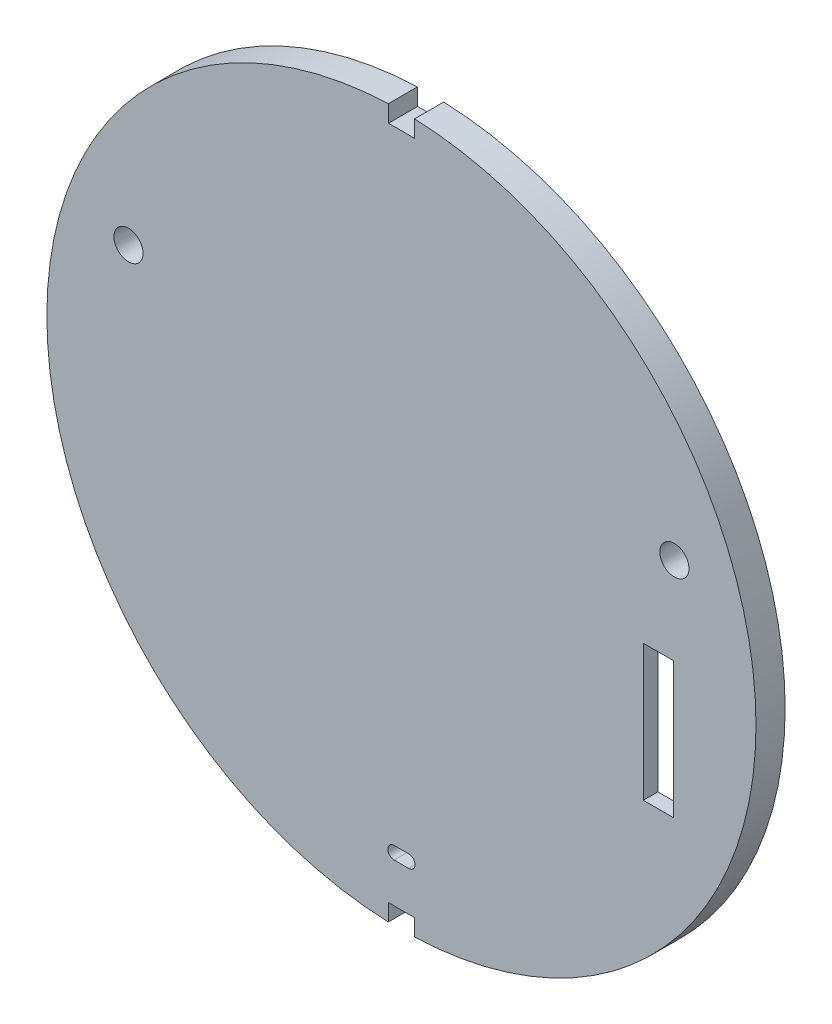
ISO-10303-21;
HEADER;
FILE_DESCRIPTION(('STEP AP214'),'2;1');
FILE_NAME('part.step','',(''),(''),'','','');
FILE_SCHEMA(('AUTOMOTIVE_DESIGN { 1 0 10303 214 1 1 1 1 }'));
ENDSEC;
DATA;
#1=APPLICATION_CONTEXT('core data for automotive mechanical design processes');
#2=APPLICATION_PROTOCOL_DEFINITION('international standard','automotive_design',2000,#1);
#3=PRODUCT_CONTEXT('',#1,'mechanical');
#4=PRODUCT('Part','Part','',(#3));
#5=PRODUCT_RELATED_PRODUCT_CATEGORY('part','',(#4));
#6=PRODUCT_DEFINITION_FORMATION('','',#4);
#7=PRODUCT_DEFINITION_CONTEXT('part definition',#1,'design');
#8=PRODUCT_DEFINITION('design','',#6,#7);
#9=PRODUCT_DEFINITION_SHAPE('','',#8);
#10=(LENGTH_UNIT() NAMED_UNIT(*) SI_UNIT(.MILLI.,.METRE.));
#11=(NAMED_UNIT(*) PLANE_ANGLE_UNIT() SI_UNIT($,.RADIAN.));
#12=(NAMED_UNIT(*) SI_UNIT($,.STERADIAN.) SOLID_ANGLE_UNIT());
#13=UNCERTAINTY_MEASURE_WITH_UNIT(LENGTH_MEASURE(1.E-05),#10,'distance_accuracy_value','');
#14=(GEOMETRIC_REPRESENTATION_CONTEXT(3) GLOBAL_UNCERTAINTY_ASSIGNED_CONTEXT((#13)) GLOBAL_UNIT_ASSIGNED_CONTEXT((#10,
#11,#12)) REPRESENTATION_CONTEXT('',''));
#15=CARTESIAN_POINT('',(0.,0.,0.));
#16=DIRECTION('',(0.,0.,1.));
#17=DIRECTION('',(1.,0.,0.));
#18=AXIS2_PLACEMENT_3D('',#15,#16,#17);
#19=CARTESIAN_POINT('',(-22.4999999999999,-22.5,-3.));
#20=DIRECTION('',(0.707106781186546,0.707106781186549,0.));
#21=DIRECTION('',(-0.707106781186549,0.707106781186546,0.));
#22=AXIS2_PLACEMENT_3D('',#19,#20,#21);
#23=PLANE('',#22);
#24=DIRECTION('',(0.,0.,1.));
#25=VECTOR('',#24,1.);
#26=CARTESIAN_POINT('',(-28.,-17.,-3.));
#27=LINE('',#26,#25);
#28=CARTESIAN_POINT('',(-28.,-17.,-3.));
#29=VERTEX_POINT('',#28);
#30=CARTESIAN_POINT('',(-28.,-17.,-1.5));
#31=VERTEX_POINT('',#30);
#32=EDGE_CURVE('E258',#29,#31,#27,.T.);
#33=ORIENTED_EDGE('',*,*,#32,.T.);
#34=DIRECTION('',(-0.707106781186549,0.707106781186546,0.));
#35=VECTOR('',#34,1.);
#36=CARTESIAN_POINT('',(-22.4999999999999,-22.5,-1.5));
#37=LINE('',#36,#35);
#38=CARTESIAN_POINT('',(-21.5,-23.5,-1.5));
#39=VERTEX_POINT('',#38);
#40=EDGE_CURVE('E462',#39,#31,#37,.T.);
#41=ORIENTED_EDGE('',*,*,#40,.F.);
#42=DIRECTION('',(0.,0.,1.));
#43=VECTOR('',#42,1.);
#44=CARTESIAN_POINT('',(-21.5,-23.5,-3.));
#45=LINE('',#44,#43);
#46=CARTESIAN_POINT('',(-21.5,-23.5,-3.));
#47=VERTEX_POINT('',#46);
#48=EDGE_CURVE('E243',#47,#39,#45,.T.);
#49=ORIENTED_EDGE('',*,*,#48,.F.);
#50=DIRECTION('',(-0.707106781186549,0.707106781186546,0.));
#51=VECTOR('',#50,1.);
#52=CARTESIAN_POINT('',(-22.4999999999999,-22.5,-3.));
#53=LINE('',#52,#51);
#54=EDGE_CURVE('E284',#47,#29,#53,.T.);
#55=ORIENTED_EDGE('',*,*,#54,.T.);
#56=EDGE_LOOP('',(#33,#41,#49,#55));
#57=FACE_BOUND('',#56,.T.);
#58=ADVANCED_FACE('F37',(#57),#23,.T.);
#59=CARTESIAN_POINT('',(0.,-23.5,-3.));
#60=DIRECTION('',(0.,1.,0.));
#61=DIRECTION('',(-1.,0.,0.));
#62=AXIS2_PLACEMENT_3D('',#59,#60,#61);
#63=PLANE('',#62);
#64=ORIENTED_EDGE('',*,*,#48,.T.);
#65=DIRECTION('',(-1.,0.,0.));
#66=VECTOR('',#65,1.);
#67=CARTESIAN_POINT('',(0.,-23.5,-1.5));
#68=LINE('',#67,#66);
#69=CARTESIAN_POINT('',(21.5,-23.5,-1.5));
#70=VERTEX_POINT('',#69);
#71=EDGE_CURVE('E459',#70,#39,#68,.T.);
#72=ORIENTED_EDGE('',*,*,#71,.F.);
#73=DIRECTION('',(0.,0.,1.));
#74=VECTOR('',#73,1.);
#75=CARTESIAN_POINT('',(21.5,-23.5,-3.));
#76=LINE('',#75,#74);
#77=CARTESIAN_POINT('',(21.5,-23.5,-3.));
#78=VERTEX_POINT('',#77);
#79=EDGE_CURVE('E246',#78,#70,#76,.T.);
#80=ORIENTED_EDGE('',*,*,#79,.F.);
#81=DIRECTION('',(-1.,0.,0.));
#82=VECTOR('',#81,1.);
#83=CARTESIAN_POINT('',(0.,-23.5,-3.));
#84=LINE('',#83,#82);
#85=EDGE_CURVE('E304',#78,#47,#84,.T.);
#86=ORIENTED_EDGE('',*,*,#85,.T.);
#87=EDGE_LOOP('',(#64,#72,#80,#86));
#88=FACE_BOUND('',#87,.T.);
#89=ADVANCED_FACE('F345',(#88),#63,.T.);
#90=CARTESIAN_POINT('',(22.5,-22.5,-3.));
#91=DIRECTION('',(-0.707106781186546,0.707106781186548,0.));
#92=DIRECTION('',(-0.707106781186549,-0.707106781186546,0.));
#93=AXIS2_PLACEMENT_3D('',#90,#91,#92);
#94=PLANE('',#93);
#95=ORIENTED_EDGE('',*,*,#79,.T.);
#96=DIRECTION('',(-0.707106781186549,-0.707106781186546,0.));
#97=VECTOR('',#96,1.);
#98=CARTESIAN_POINT('',(22.5,-22.5,-1.5));
#99=LINE('',#98,#97);
#100=CARTESIAN_POINT('',(28.,-17.,-1.5));
#101=VERTEX_POINT('',#100);
#102=EDGE_CURVE('E418',#101,#70,#99,.T.);
#103=ORIENTED_EDGE('',*,*,#102,.F.);
#104=DIRECTION('',(0.,0.,1.));
#105=VECTOR('',#104,1.);
#106=CARTESIAN_POINT('',(28.,-17.,-3.));
#107=LINE('',#106,#105);
#108=CARTESIAN_POINT('',(28.,-17.,-3.));
#109=VERTEX_POINT('',#108);
#110=EDGE_CURVE('E249',#109,#101,#107,.T.);
#111=ORIENTED_EDGE('',*,*,#110,.F.);
#112=DIRECTION('',(-0.707106781186549,-0.707106781186546,0.));
#113=VECTOR('',#112,1.);
#114=CARTESIAN_POINT('',(22.5,-22.5,-3.));
#115=LINE('',#114,#113);
#116=EDGE_CURVE('E301',#109,#78,#115,.T.);
#117=ORIENTED_EDGE('',*,*,#116,.T.);
#118=EDGE_LOOP('',(#95,#103,#111,#117));
#119=FACE_BOUND('',#118,.T.);
#120=ADVANCED_FACE('F351',(#119),#94,.T.);
#121=CARTESIAN_POINT('',(28.,0.,-3.));
#122=DIRECTION('',(-1.,0.,0.));
#123=DIRECTION('',(0.,-1.,0.));
#124=AXIS2_PLACEMENT_3D('',#121,#122,#123);
#125=PLANE('',#124);
#126=DIRECTION('',(0.,-1.,0.));
#127=VECTOR('',#126,1.);
#128=CARTESIAN_POINT('',(28.,0.,-1.5));
#129=LINE('',#128,#127);
#130=CARTESIAN_POINT('',(28.,-12.5,-1.5));
#131=VERTEX_POINT('',#130);
#132=EDGE_CURVE('E421',#131,#101,#129,.T.);
#133=ORIENTED_EDGE('',*,*,#132,.F.);
#134=DIRECTION('',(0.,0.,1.));
#135=VECTOR('',#134,1.);
#136=CARTESIAN_POINT('',(28.,-12.5,-1.5));
#137=LINE('',#136,#135);
#138=CARTESIAN_POINT('',(28.,-12.5,0.));
#139=VERTEX_POINT('',#138);
#140=EDGE_CURVE('E194',#131,#139,#137,.T.);
#141=ORIENTED_EDGE('',*,*,#140,.T.);
#142=DIRECTION('',(0.,-1.,0.));
#143=VECTOR('',#142,1.);
#144=CARTESIAN_POINT('',(28.,0.,0.));
#145=LINE('',#144,#143);
#146=CARTESIAN_POINT('',(28.,1.5,0.));
#147=VERTEX_POINT('',#146);
#148=EDGE_CURVE('E201',#147,#139,#145,.T.);
#149=ORIENTED_EDGE('',*,*,#148,.F.);
#150=DIRECTION('',(0.,0.,1.));
#151=VECTOR('',#150,1.);
#152=CARTESIAN_POINT('',(28.,1.5,-1.5));
#153=LINE('',#152,#151);
#154=CARTESIAN_POINT('',(28.,1.5,-1.5));
#155=VERTEX_POINT('',#154);
#156=EDGE_CURVE('E477',#155,#147,#153,.T.);
#157=ORIENTED_EDGE('',*,*,#156,.F.);
#158=CARTESIAN_POINT('',(28.,4.5,-1.5));
#159=VERTEX_POINT('',#158);
#160=EDGE_CURVE('E407',#159,#155,#129,.T.);
#161=ORIENTED_EDGE('',*,*,#160,.F.);
#162=DIRECTION('',(0.,0.,1.));
#163=VECTOR('',#162,1.);
#164=CARTESIAN_POINT('',(28.,4.5,-3.));
#165=LINE('',#164,#163);
#166=CARTESIAN_POINT('',(28.,4.5,-3.));
#167=VERTEX_POINT('',#166);
#168=EDGE_CURVE('E252',#167,#159,#165,.T.);
#169=ORIENTED_EDGE('',*,*,#168,.F.);
#170=DIRECTION('',(0.,-1.,0.));
#171=VECTOR('',#170,1.);
#172=CARTESIAN_POINT('',(28.,0.,-3.));
#173=LINE('',#172,#171);
#174=EDGE_CURVE('E298',#167,#109,#173,.T.);
#175=ORIENTED_EDGE('',*,*,#174,.T.);
#176=ORIENTED_EDGE('',*,*,#110,.T.);
#177=EDGE_LOOP('',(#133,#141,#149,#157,#161,#169,#175,#176));
#178=FACE_BOUND('',#177,.T.);
#179=ADVANCED_FACE('F383',(#178),#125,.T.);
#180=CARTESIAN_POINT('',(0.,4.5,-3.));
#181=DIRECTION('',(0.,-1.,0.));
#182=DIRECTION('',(1.,0.,0.));
#183=AXIS2_PLACEMENT_3D('',#180,#181,#182);
#184=PLANE('',#183);
#185=ORIENTED_EDGE('',*,*,#168,.T.);
#186=DIRECTION('',(1.,0.,0.));
#187=VECTOR('',#186,1.);
#188=CARTESIAN_POINT('',(0.,4.5,-1.5));
#189=LINE('',#188,#187);
#190=CARTESIAN_POINT('',(-28.,4.5,-1.5));
#191=VERTEX_POINT('',#190);
#192=EDGE_CURVE('E398',#191,#159,#189,.T.);
#193=ORIENTED_EDGE('',*,*,#192,.F.);
#194=DIRECTION('',(0.,0.,1.));
#195=VECTOR('',#194,1.);
#196=CARTESIAN_POINT('',(-28.,4.5,-3.));
#197=LINE('',#196,#195);
#198=CARTESIAN_POINT('',(-28.,4.5,-3.));
#199=VERTEX_POINT('',#198);
#200=EDGE_CURVE('E255',#199,#191,#197,.T.);
#201=ORIENTED_EDGE('',*,*,#200,.F.);
#202=DIRECTION('',(1.,0.,0.));
#203=VECTOR('',#202,1.);
#204=CARTESIAN_POINT('',(0.,4.5,-3.));
#205=LINE('',#204,#203);
#206=EDGE_CURVE('E295',#199,#167,#205,.T.);
#207=ORIENTED_EDGE('',*,*,#206,.T.);
#208=EDGE_LOOP('',(#185,#193,#201,#207));
#209=FACE_BOUND('',#208,.T.);
#210=ADVANCED_FACE('F386',(#209),#184,.T.);
#211=CARTESIAN_POINT('',(-28.,0.,-3.));
#212=DIRECTION('',(1.,0.,0.));
#213=DIRECTION('',(0.,0.,-1.));
#214=AXIS2_PLACEMENT_3D('',#211,#212,#213);
#215=PLANE('',#214);
#216=ORIENTED_EDGE('',*,*,#200,.T.);
#217=DIRECTION('',(0.,1.,0.));
#218=VECTOR('',#217,1.);
#219=CARTESIAN_POINT('',(-28.,0.,-1.5));
#220=LINE('',#219,#218);
#221=EDGE_CURVE('E465',#31,#191,#220,.T.);
#222=ORIENTED_EDGE('',*,*,#221,.F.);
#223=ORIENTED_EDGE('',*,*,#32,.F.);
#224=DIRECTION('',(0.,1.,0.));
#225=VECTOR('',#224,1.);
#226=CARTESIAN_POINT('',(-28.,0.,-3.));
#227=LINE('',#226,#225);
#228=EDGE_CURVE('E288',#29,#199,#227,.T.);
#229=ORIENTED_EDGE('',*,*,#228,.T.);
#230=EDGE_LOOP('',(#216,#222,#223,#229));
#231=FACE_BOUND('',#230,.T.);
#232=ADVANCED_FACE('F341',(#231),#215,.T.);
#233=CARTESIAN_POINT('',(1.35,0.,-3.));
#234=DIRECTION('',(-1.,0.,0.));
#235=DIRECTION('',(0.,-1.,0.));
#236=AXIS2_PLACEMENT_3D('',#233,#234,#235);
#237=PLANE('',#236);
#238=DIRECTION('',(0.,-1.,0.));
#239=VECTOR('',#238,1.);
#240=CARTESIAN_POINT('',(1.35,0.,0.));
#241=LINE('',#240,#239);
#242=CARTESIAN_POINT('',(1.35,-34.7237670767444,0.));
#243=VERTEX_POINT('',#242);
#244=CARTESIAN_POINT('',(1.35,-36.4750257025269,0.));
#245=VERTEX_POINT('',#244);
#246=EDGE_CURVE('E209',#243,#245,#241,.T.);
#247=ORIENTED_EDGE('',*,*,#246,.F.);
#248=DIRECTION('',(0.,0.,1.));
#249=VECTOR('',#248,1.);
#250=CARTESIAN_POINT('',(1.35,-34.7237670767444,-3.));
#251=LINE('',#250,#249);
#252=CARTESIAN_POINT('',(1.35,-34.7237670767444,-3.));
#253=VERTEX_POINT('',#252);
#254=EDGE_CURVE('E11',#253,#243,#251,.T.);
#255=ORIENTED_EDGE('',*,*,#254,.F.);
#256=DIRECTION('',(0.,-1.,0.));
#257=VECTOR('',#256,1.);
#258=CARTESIAN_POINT('',(1.35,0.,-3.));
#259=LINE('',#258,#257);
#260=CARTESIAN_POINT('',(1.35,-36.4750257025269,-3.));
#261=VERTEX_POINT('',#260);
#262=EDGE_CURVE('E313',#253,#261,#259,.T.);
#263=ORIENTED_EDGE('',*,*,#262,.T.);
#264=DIRECTION('',(0.,0.,1.));
#265=VECTOR('',#264,1.);
#266=CARTESIAN_POINT('',(1.35,-36.4750257025269,-3.));
#267=LINE('',#266,#265);
#268=EDGE_CURVE('E241',#261,#245,#267,.T.);
#269=ORIENTED_EDGE('',*,*,#268,.T.);
#270=EDGE_LOOP('',(#247,#255,#263,#269));
#271=FACE_BOUND('',#270,.T.);
#272=ADVANCED_FACE('F331',(#271),#237,.T.);
#273=CARTESIAN_POINT('',(0.,0.,-3.));
#274=DIRECTION('',(0.,0.,1.));
#275=DIRECTION('',(1.,0.,0.));
#276=AXIS2_PLACEMENT_3D('',#273,#274,#275);
#277=CYLINDRICAL_SURFACE('',#276,34.75);
#278=CARTESIAN_POINT('',(0.,0.,0.));
#279=DIRECTION('',(0.,0.,1.));
#280=DIRECTION('',(1.,0.,0.));
#281=AXIS2_PLACEMENT_3D('',#278,#279,#280);
#282=CIRCLE('',#281,34.75);
#283=CARTESIAN_POINT('',(-1.34999999999998,-34.7237670767444,0.));
#284=VERTEX_POINT('',#283);
#285=EDGE_CURVE('E227',#284,#243,#282,.T.);
#286=ORIENTED_EDGE('',*,*,#285,.F.);
#287=DIRECTION('',(0.,0.,1.));
#288=VECTOR('',#287,1.);
#289=CARTESIAN_POINT('',(-1.34999999999998,-34.7237670767444,-3.));
#290=LINE('',#289,#288);
#291=CARTESIAN_POINT('',(-1.34999999999998,-34.7237670767444,-3.));
#292=VERTEX_POINT('',#291);
#293=EDGE_CURVE('E46',#292,#284,#290,.T.);
#294=ORIENTED_EDGE('',*,*,#293,.F.);
#295=CARTESIAN_POINT('',(0.,0.,-3.));
#296=DIRECTION('',(0.,0.,1.));
#297=DIRECTION('',(1.,0.,0.));
#298=AXIS2_PLACEMENT_3D('',#295,#296,#297);
#299=CIRCLE('',#298,34.75);
#300=EDGE_CURVE('E179',#292,#253,#299,.T.);
#301=ORIENTED_EDGE('',*,*,#300,.T.);
#302=ORIENTED_EDGE('',*,*,#254,.T.);
#303=EDGE_LOOP('',(#286,#294,#301,#302));
#304=FACE_BOUND('',#303,.T.);
#305=ADVANCED_FACE('F333',(#304),#277,.T.);
#306=CARTESIAN_POINT('',(-1.34999999999999,0.,-3.));
#307=DIRECTION('',(1.,0.,0.));
#308=DIRECTION('',(0.,1.,0.));
#309=AXIS2_PLACEMENT_3D('',#306,#307,#308);
#310=PLANE('',#309);
#311=DIRECTION('',(0.,1.,0.));
#312=VECTOR('',#311,1.);
#313=CARTESIAN_POINT('',(-1.34999999999999,0.,0.));
#314=LINE('',#313,#312);
#315=CARTESIAN_POINT('',(-1.34999999999998,-36.4750257025269,0.));
#316=VERTEX_POINT('',#315);
#317=EDGE_CURVE('E167',#316,#284,#314,.T.);
#318=ORIENTED_EDGE('',*,*,#317,.F.);
#319=DIRECTION('',(0.,0.,1.));
#320=VECTOR('',#319,1.);
#321=CARTESIAN_POINT('',(-1.34999999999998,-36.4750257025269,-3.));
#322=LINE('',#321,#320);
#323=CARTESIAN_POINT('',(-1.34999999999998,-36.4750257025269,-3.));
#324=VERTEX_POINT('',#323);
#325=EDGE_CURVE('E161',#324,#316,#322,.T.);
#326=ORIENTED_EDGE('',*,*,#325,.F.);
#327=DIRECTION('',(0.,1.,0.));
#328=VECTOR('',#327,1.);
#329=CARTESIAN_POINT('',(-1.34999999999999,0.,-3.));
#330=LINE('',#329,#328);
#331=EDGE_CURVE('E164',#324,#292,#330,.T.);
#332=ORIENTED_EDGE('',*,*,#331,.T.);
#333=ORIENTED_EDGE('',*,*,#293,.T.);
#334=EDGE_LOOP('',(#318,#326,#332,#333));
#335=FACE_BOUND('',#334,.T.);
#336=ADVANCED_FACE('F163',(#335),#310,.T.);
#337=CARTESIAN_POINT('',(0.,0.,-3.));
#338=DIRECTION('',(0.,0.,1.));
#339=DIRECTION('',(1.,0.,0.));
#340=AXIS2_PLACEMENT_3D('',#337,#338,#339);
#341=CYLINDRICAL_SURFACE('',#340,36.5);
#342=CARTESIAN_POINT('',(0.,0.,0.));
#343=DIRECTION('',(0.,0.,1.));
#344=DIRECTION('',(1.,0.,0.));
#345=AXIS2_PLACEMENT_3D('',#342,#343,#344);
#346=CIRCLE('',#345,36.5);
#347=CARTESIAN_POINT('',(-1.35,36.4750257025269,0.));
#348=VERTEX_POINT('',#347);
#349=EDGE_CURVE('E224',#348,#316,#346,.T.);
#350=ORIENTED_EDGE('',*,*,#349,.F.);
#351=DIRECTION('',(0.,0.,1.));
#352=VECTOR('',#351,1.);
#353=CARTESIAN_POINT('',(-1.35,36.4750257025269,-3.));
#354=LINE('',#353,#352);
#355=CARTESIAN_POINT('',(-1.35,36.4750257025269,-3.));
#356=VERTEX_POINT('',#355);
#357=EDGE_CURVE('E172',#356,#348,#354,.T.);
#358=ORIENTED_EDGE('',*,*,#357,.F.);
#359=CARTESIAN_POINT('',(0.,0.,-3.));
#360=DIRECTION('',(0.,0.,1.));
#361=DIRECTION('',(1.,0.,0.));
#362=AXIS2_PLACEMENT_3D('',#359,#360,#361);
#363=CIRCLE('',#362,36.5);
#364=EDGE_CURVE('E178',#356,#324,#363,.T.);
#365=ORIENTED_EDGE('',*,*,#364,.T.);
#366=ORIENTED_EDGE('',*,*,#325,.T.);
#367=EDGE_LOOP('',(#350,#358,#365,#366));
#368=FACE_BOUND('',#367,.T.);
#369=ADVANCED_FACE('F181',(#368),#341,.T.);
#370=CARTESIAN_POINT('',(-1.34999999999999,0.,-3.));
#371=DIRECTION('',(-1.,0.,0.));
#372=DIRECTION('',(0.,-1.,0.));
#373=AXIS2_PLACEMENT_3D('',#370,#371,#372);
#374=PLANE('',#373);
#375=DIRECTION('',(0.,-1.,0.));
#376=VECTOR('',#375,1.);
#377=CARTESIAN_POINT('',(-1.34999999999999,0.,0.));
#378=LINE('',#377,#376);
#379=CARTESIAN_POINT('',(-1.35,34.7237670767444,0.));
#380=VERTEX_POINT('',#379);
#381=EDGE_CURVE('E221',#348,#380,#378,.T.);
#382=ORIENTED_EDGE('',*,*,#381,.T.);
#383=DIRECTION('',(0.,0.,1.));
#384=VECTOR('',#383,1.);
#385=CARTESIAN_POINT('',(-1.35,34.7237670767444,-3.));
#386=LINE('',#385,#384);
#387=CARTESIAN_POINT('',(-1.35,34.7237670767444,-3.));
#388=VERTEX_POINT('',#387);
#389=EDGE_CURVE('E233',#388,#380,#386,.T.);
#390=ORIENTED_EDGE('',*,*,#389,.F.);
#391=DIRECTION('',(0.,-1.,0.));
#392=VECTOR('',#391,1.);
#393=CARTESIAN_POINT('',(-1.34999999999999,0.,-3.));
#394=LINE('',#393,#392);
#395=EDGE_CURVE('E183',#356,#388,#394,.T.);
#396=ORIENTED_EDGE('',*,*,#395,.F.);
#397=ORIENTED_EDGE('',*,*,#357,.T.);
#398=EDGE_LOOP('',(#382,#390,#396,#397));
#399=FACE_BOUND('',#398,.T.);
#400=ADVANCED_FACE('F614',(#399),#374,.F.);
#401=CARTESIAN_POINT('',(0.,0.,-3.));
#402=DIRECTION('',(0.,0.,1.));
#403=DIRECTION('',(1.,0.,0.));
#404=AXIS2_PLACEMENT_3D('',#401,#402,#403);
#405=CYLINDRICAL_SURFACE('',#404,34.75);
#406=CARTESIAN_POINT('',(0.,0.,0.));
#407=DIRECTION('',(0.,0.,1.));
#408=DIRECTION('',(1.,0.,0.));
#409=AXIS2_PLACEMENT_3D('',#406,#407,#408);
#410=CIRCLE('',#409,34.75);
#411=CARTESIAN_POINT('',(1.35,34.7237670767444,0.));
#412=VERTEX_POINT('',#411);
#413=EDGE_CURVE('E218',#380,#412,#410,.F.);
#414=ORIENTED_EDGE('',*,*,#413,.T.);
#415=DIRECTION('',(0.,0.,1.));
#416=VECTOR('',#415,1.);
#417=CARTESIAN_POINT('',(1.35,34.7237670767444,-3.));
#418=LINE('',#417,#416);
#419=CARTESIAN_POINT('',(1.35,34.7237670767444,-3.));
#420=VERTEX_POINT('',#419);
#421=EDGE_CURVE('E236',#420,#412,#418,.T.);
#422=ORIENTED_EDGE('',*,*,#421,.F.);
#423=CARTESIAN_POINT('',(0.,0.,-3.));
#424=DIRECTION('',(0.,0.,1.));
#425=DIRECTION('',(1.,0.,0.));
#426=AXIS2_PLACEMENT_3D('',#423,#424,#425);
#427=CIRCLE('',#426,34.75);
#428=EDGE_CURVE('E185',#388,#420,#427,.F.);
#429=ORIENTED_EDGE('',*,*,#428,.F.);
#430=ORIENTED_EDGE('',*,*,#389,.T.);
#431=EDGE_LOOP('',(#414,#422,#429,#430));
#432=FACE_BOUND('',#431,.T.);
#433=ADVANCED_FACE('F325',(#432),#405,.T.);
#434=CARTESIAN_POINT('',(1.35,0.,-3.));
#435=DIRECTION('',(1.,0.,0.));
#436=DIRECTION('',(0.,1.,0.));
#437=AXIS2_PLACEMENT_3D('',#434,#435,#436);
#438=PLANE('',#437);
#439=DIRECTION('',(0.,1.,0.));
#440=VECTOR('',#439,1.);
#441=CARTESIAN_POINT('',(1.35,0.,0.));
#442=LINE('',#441,#440);
#443=CARTESIAN_POINT('',(1.35,36.4750257025269,0.));
#444=VERTEX_POINT('',#443);
#445=EDGE_CURVE('E215',#412,#444,#442,.T.);
#446=ORIENTED_EDGE('',*,*,#445,.T.);
#447=DIRECTION('',(0.,0.,1.));
#448=VECTOR('',#447,1.);
#449=CARTESIAN_POINT('',(1.35,36.4750257025269,-3.));
#450=LINE('',#449,#448);
#451=CARTESIAN_POINT('',(1.35,36.4750257025269,-3.));
#452=VERTEX_POINT('',#451);
#453=EDGE_CURVE('E239',#452,#444,#450,.T.);
#454=ORIENTED_EDGE('',*,*,#453,.F.);
#455=DIRECTION('',(0.,1.,0.));
#456=VECTOR('',#455,1.);
#457=CARTESIAN_POINT('',(1.35,0.,-3.));
#458=LINE('',#457,#456);
#459=EDGE_CURVE('E318',#420,#452,#458,.T.);
#460=ORIENTED_EDGE('',*,*,#459,.F.);
#461=ORIENTED_EDGE('',*,*,#421,.T.);
#462=EDGE_LOOP('',(#446,#454,#460,#461));
#463=FACE_BOUND('',#462,.T.);
#464=ADVANCED_FACE('F327',(#463),#438,.F.);
#465=CARTESIAN_POINT('',(0.750000000000009,-30.,-3.));
#466=DIRECTION('',(0.,0.,1.));
#467=DIRECTION('',(1.,0.,0.));
#468=AXIS2_PLACEMENT_3D('',#465,#466,#467);
#469=CYLINDRICAL_SURFACE('',#468,0.649999999999998);
#470=CARTESIAN_POINT('',(0.750000000000009,-30.,0.));
#471=DIRECTION('',(0.,0.,1.));
#472=DIRECTION('',(1.,0.,0.));
#473=AXIS2_PLACEMENT_3D('',#470,#471,#472);
#474=CIRCLE('',#473,0.649999999999998);
#475=CARTESIAN_POINT('',(0.75000000000001,-30.65,0.));
#476=VERTEX_POINT('',#475);
#477=CARTESIAN_POINT('',(0.750000000000009,-29.35,0.));
#478=VERTEX_POINT('',#477);
#479=EDGE_CURVE('E190',#476,#478,#474,.T.);
#480=ORIENTED_EDGE('',*,*,#479,.T.);
#481=DIRECTION('',(0.,0.,1.));
#482=VECTOR('',#481,1.);
#483=CARTESIAN_POINT('',(0.750000000000009,-29.35,-3.));
#484=LINE('',#483,#482);
#485=CARTESIAN_POINT('',(0.750000000000009,-29.35,-3.));
#486=VERTEX_POINT('',#485);
#487=EDGE_CURVE('E261',#486,#478,#484,.T.);
#488=ORIENTED_EDGE('',*,*,#487,.F.);
#489=CARTESIAN_POINT('',(0.750000000000009,-30.,-3.));
#490=DIRECTION('',(0.,0.,1.));
#491=DIRECTION('',(1.,0.,0.));
#492=AXIS2_PLACEMENT_3D('',#489,#490,#491);
#493=CIRCLE('',#492,0.649999999999998);
#494=CARTESIAN_POINT('',(0.75000000000001,-30.65,-3.));
#495=VERTEX_POINT('',#494);
#496=EDGE_CURVE('E229',#495,#486,#493,.T.);
#497=ORIENTED_EDGE('',*,*,#496,.F.);
#498=DIRECTION('',(0.,0.,1.));
#499=VECTOR('',#498,1.);
#500=CARTESIAN_POINT('',(0.75000000000001,-30.65,-3.));
#501=LINE('',#500,#499);
#502=EDGE_CURVE('E41',#495,#476,#501,.T.);
#503=ORIENTED_EDGE('',*,*,#502,.T.);
#504=EDGE_LOOP('',(#480,#488,#497,#503));
#505=FACE_BOUND('',#504,.T.);
#506=ADVANCED_FACE('F39',(#505),#469,.F.);
#507=CARTESIAN_POINT('',(0.,-29.35,-3.));
#508=DIRECTION('',(0.,-1.,0.));
#509=DIRECTION('',(0.,0.,-1.));
#510=AXIS2_PLACEMENT_3D('',#507,#508,#509);
#511=PLANE('',#510);
#512=DIRECTION('',(1.,0.,0.));
#513=VECTOR('',#512,1.);
#514=CARTESIAN_POINT('',(0.,-29.35,0.));
#515=LINE('',#514,#513);
#516=CARTESIAN_POINT('',(-0.749999999999991,-29.35,0.));
#517=VERTEX_POINT('',#516);
#518=EDGE_CURVE('E198',#517,#478,#515,.T.);
#519=ORIENTED_EDGE('',*,*,#518,.F.);
#520=DIRECTION('',(0.,0.,1.));
#521=VECTOR('',#520,1.);
#522=CARTESIAN_POINT('',(-0.749999999999991,-29.35,-3.));
#523=LINE('',#522,#521);
#524=CARTESIAN_POINT('',(-0.749999999999991,-29.35,-3.));
#525=VERTEX_POINT('',#524);
#526=EDGE_CURVE('E263',#525,#517,#523,.T.);
#527=ORIENTED_EDGE('',*,*,#526,.F.);
#528=DIRECTION('',(1.,0.,0.));
#529=VECTOR('',#528,1.);
#530=CARTESIAN_POINT('',(0.,-29.35,-3.));
#531=LINE('',#530,#529);
#532=EDGE_CURVE('E283',#525,#486,#531,.T.);
#533=ORIENTED_EDGE('',*,*,#532,.T.);
#534=ORIENTED_EDGE('',*,*,#487,.T.);
#535=EDGE_LOOP('',(#519,#527,#533,#534));
#536=FACE_BOUND('',#535,.T.);
#537=ADVANCED_FACE('F279',(#536),#511,.T.);
#538=CARTESIAN_POINT('',(-0.749999999999991,-30.,-3.));
#539=DIRECTION('',(0.,0.,1.));
#540=DIRECTION('',(1.,0.,0.));
#541=AXIS2_PLACEMENT_3D('',#538,#539,#540);
#542=CYLINDRICAL_SURFACE('',#541,0.649999999999998);
#543=CARTESIAN_POINT('',(-0.749999999999991,-30.,0.));
#544=DIRECTION('',(0.,0.,1.));
#545=DIRECTION('',(1.,0.,0.));
#546=AXIS2_PLACEMENT_3D('',#543,#544,#545);
#547=CIRCLE('',#546,0.649999999999998);
#548=CARTESIAN_POINT('',(-0.749999999999991,-30.65,0.));
#549=VERTEX_POINT('',#548);
#550=EDGE_CURVE('E196',#517,#549,#547,.T.);
#551=ORIENTED_EDGE('',*,*,#550,.T.);
#552=DIRECTION('',(0.,0.,1.));
#553=VECTOR('',#552,1.);
#554=CARTESIAN_POINT('',(-0.749999999999991,-30.65,-3.));
#555=LINE('',#554,#553);
#556=CARTESIAN_POINT('',(-0.749999999999991,-30.65,-3.));
#557=VERTEX_POINT('',#556);
#558=EDGE_CURVE('E264',#557,#549,#555,.T.);
#559=ORIENTED_EDGE('',*,*,#558,.F.);
#560=CARTESIAN_POINT('',(-0.749999999999991,-30.,-3.));
#561=DIRECTION('',(0.,0.,1.));
#562=DIRECTION('',(1.,0.,0.));
#563=AXIS2_PLACEMENT_3D('',#560,#561,#562);
#564=CIRCLE('',#563,0.649999999999998);
#565=EDGE_CURVE('E285',#525,#557,#564,.T.);
#566=ORIENTED_EDGE('',*,*,#565,.F.);
#567=ORIENTED_EDGE('',*,*,#526,.T.);
#568=EDGE_LOOP('',(#551,#559,#566,#567));
#569=FACE_BOUND('',#568,.T.);
#570=ADVANCED_FACE('F359',(#569),#542,.F.);
#571=CARTESIAN_POINT('',(-28.1,10.5,-3.));
#572=DIRECTION('',(0.,0.,1.));
#573=DIRECTION('',(1.,0.,0.));
#574=AXIS2_PLACEMENT_3D('',#571,#572,#573);
#575=CYLINDRICAL_SURFACE('',#574,1.5);
#576=CARTESIAN_POINT('',(-28.1,10.5,-3.));
#577=DIRECTION('',(0.,0.,1.));
#578=DIRECTION('',(1.,0.,0.));
#579=AXIS2_PLACEMENT_3D('',#576,#577,#578);
#580=CIRCLE('',#579,1.5);
#581=CARTESIAN_POINT('',(-26.6,10.5,-3.));
#582=VERTEX_POINT('',#581);
#583=EDGE_CURVE('E310',#582,#582,#580,.T.);
#584=ORIENTED_EDGE('',*,*,#583,.F.);
#585=EDGE_LOOP('',(#584));
#586=FACE_BOUND('',#585,.T.);
#587=CARTESIAN_POINT('',(-28.1,10.5,0.));
#588=DIRECTION('',(0.,0.,1.));
#589=DIRECTION('',(1.,0.,0.));
#590=AXIS2_PLACEMENT_3D('',#587,#588,#589);
#591=CIRCLE('',#590,1.5);
#592=CARTESIAN_POINT('',(-26.6,10.5,0.));
#593=VERTEX_POINT('',#592);
#594=EDGE_CURVE('E206',#593,#593,#591,.T.);
#595=ORIENTED_EDGE('',*,*,#594,.T.);
#596=EDGE_LOOP('',(#595));
#597=FACE_BOUND('',#596,.T.);
#598=ADVANCED_FACE('F361',(#586,#597),#575,.F.);
#599=CARTESIAN_POINT('',(28.1,10.5,-3.));
#600=DIRECTION('',(0.,0.,1.));
#601=DIRECTION('',(1.,0.,0.));
#602=AXIS2_PLACEMENT_3D('',#599,#600,#601);
#603=CYLINDRICAL_SURFACE('',#602,1.5);
#604=CARTESIAN_POINT('',(28.1,10.5,-3.));
#605=DIRECTION('',(0.,0.,1.));
#606=DIRECTION('',(1.,0.,0.));
#607=AXIS2_PLACEMENT_3D('',#604,#605,#606);
#608=CIRCLE('',#607,1.5);
#609=CARTESIAN_POINT('',(29.6,10.5,-3.));
#610=VERTEX_POINT('',#609);
#611=EDGE_CURVE('E307',#610,#610,#608,.T.);
#612=ORIENTED_EDGE('',*,*,#611,.F.);
#613=EDGE_LOOP('',(#612));
#614=FACE_BOUND('',#613,.T.);
#615=CARTESIAN_POINT('',(28.1,10.5,0.));
#616=DIRECTION('',(0.,0.,1.));
#617=DIRECTION('',(1.,0.,0.));
#618=AXIS2_PLACEMENT_3D('',#615,#616,#617);
#619=CIRCLE('',#618,1.5);
#620=CARTESIAN_POINT('',(29.6,10.5,0.));
#621=VERTEX_POINT('',#620);
#622=EDGE_CURVE('E203',#621,#621,#619,.T.);
#623=ORIENTED_EDGE('',*,*,#622,.T.);
#624=EDGE_LOOP('',(#623));
#625=FACE_BOUND('',#624,.T.);
#626=ADVANCED_FACE('F365',(#614,#625),#603,.F.);
#627=CARTESIAN_POINT('',(0.,-30.65,-3.));
#628=DIRECTION('',(0.,-1.,0.));
#629=DIRECTION('',(0.,0.,-1.));
#630=AXIS2_PLACEMENT_3D('',#627,#628,#629);
#631=PLANE('',#630);
#632=DIRECTION('',(1.,0.,0.));
#633=VECTOR('',#632,1.);
#634=CARTESIAN_POINT('',(0.,-30.65,0.));
#635=LINE('',#634,#633);
#636=EDGE_CURVE('E193',#549,#476,#635,.T.);
#637=ORIENTED_EDGE('',*,*,#636,.T.);
#638=ORIENTED_EDGE('',*,*,#502,.F.);
#639=DIRECTION('',(1.,0.,0.));
#640=VECTOR('',#639,1.);
#641=CARTESIAN_POINT('',(0.,-30.65,-3.));
#642=LINE('',#641,#640);
#643=EDGE_CURVE('E113',#557,#495,#642,.T.);
#644=ORIENTED_EDGE('',*,*,#643,.F.);
#645=ORIENTED_EDGE('',*,*,#558,.T.);
#646=EDGE_LOOP('',(#637,#638,#644,#645));
#647=FACE_BOUND('',#646,.T.);
#648=ADVANCED_FACE('F363',(#647),#631,.F.);
#649=CARTESIAN_POINT('',(0.,0.,-3.));
#650=DIRECTION('',(0.,0.,1.));
#651=DIRECTION('',(1.,0.,0.));
#652=AXIS2_PLACEMENT_3D('',#649,#650,#651);
#653=CYLINDRICAL_SURFACE('',#652,36.5);
#654=CARTESIAN_POINT('',(0.,0.,0.));
#655=DIRECTION('',(0.,0.,1.));
#656=DIRECTION('',(1.,0.,0.));
#657=AXIS2_PLACEMENT_3D('',#654,#655,#656);
#658=CIRCLE('',#657,36.5);
#659=EDGE_CURVE('E212',#245,#444,#658,.T.);
#660=ORIENTED_EDGE('',*,*,#659,.F.);
#661=ORIENTED_EDGE('',*,*,#268,.F.);
#662=CARTESIAN_POINT('',(0.,0.,-3.));
#663=DIRECTION('',(0.,0.,1.));
#664=DIRECTION('',(1.,0.,0.));
#665=AXIS2_PLACEMENT_3D('',#662,#663,#664);
#666=CIRCLE('',#665,36.5);
#667=EDGE_CURVE('E315',#261,#452,#666,.T.);
#668=ORIENTED_EDGE('',*,*,#667,.T.);
#669=ORIENTED_EDGE('',*,*,#453,.T.);
#670=EDGE_LOOP('',(#660,#661,#668,#669));
#671=FACE_BOUND('',#670,.T.);
#672=ADVANCED_FACE('F330',(#671),#653,.T.);
#673=CARTESIAN_POINT('',(0.,0.,-3.));
#674=DIRECTION('',(0.,0.,1.));
#675=DIRECTION('',(1.,0.,0.));
#676=AXIS2_PLACEMENT_3D('',#673,#674,#675);
#677=PLANE('',#676);
#678=ORIENTED_EDGE('',*,*,#496,.T.);
#679=ORIENTED_EDGE('',*,*,#532,.F.);
#680=ORIENTED_EDGE('',*,*,#565,.T.);
#681=ORIENTED_EDGE('',*,*,#643,.T.);
#682=EDGE_LOOP('',(#678,#679,#680,#681));
#683=FACE_BOUND('',#682,.T.);
#684=ORIENTED_EDGE('',*,*,#54,.F.);
#685=ORIENTED_EDGE('',*,*,#85,.F.);
#686=ORIENTED_EDGE('',*,*,#116,.F.);
#687=ORIENTED_EDGE('',*,*,#174,.F.);
#688=ORIENTED_EDGE('',*,*,#206,.F.);
#689=ORIENTED_EDGE('',*,*,#228,.F.);
#690=EDGE_LOOP('',(#684,#685,#686,#687,#688,#689));
#691=FACE_BOUND('',#690,.T.);
#692=ORIENTED_EDGE('',*,*,#611,.T.);
#693=EDGE_LOOP('',(#692));
#694=FACE_BOUND('',#693,.T.);
#695=ORIENTED_EDGE('',*,*,#583,.T.);
#696=EDGE_LOOP('',(#695));
#697=FACE_BOUND('',#696,.T.);
#698=ORIENTED_EDGE('',*,*,#262,.F.);
#699=ORIENTED_EDGE('',*,*,#300,.F.);
#700=ORIENTED_EDGE('',*,*,#331,.F.);
#701=ORIENTED_EDGE('',*,*,#364,.F.);
#702=ORIENTED_EDGE('',*,*,#395,.T.);
#703=ORIENTED_EDGE('',*,*,#428,.T.);
#704=ORIENTED_EDGE('',*,*,#459,.T.);
#705=ORIENTED_EDGE('',*,*,#667,.F.);
#706=EDGE_LOOP('',(#698,#699,#700,#701,#702,#703,#704,#705));
#707=FACE_BOUND('',#706,.T.);
#708=ADVANCED_FACE('F176',(#683,#691,#694,#697,#707),#677,.F.);
#709=CARTESIAN_POINT('',(0.,0.,0.));
#710=DIRECTION('',(0.,0.,1.));
#711=DIRECTION('',(1.,0.,0.));
#712=AXIS2_PLACEMENT_3D('',#709,#710,#711);
#713=PLANE('',#712);
#714=ORIENTED_EDGE('',*,*,#479,.F.);
#715=ORIENTED_EDGE('',*,*,#636,.F.);
#716=ORIENTED_EDGE('',*,*,#550,.F.);
#717=ORIENTED_EDGE('',*,*,#518,.T.);
#718=EDGE_LOOP('',(#714,#715,#716,#717));
#719=FACE_BOUND('',#718,.T.);
#720=ORIENTED_EDGE('',*,*,#148,.T.);
#721=DIRECTION('',(1.,0.,0.));
#722=VECTOR('',#721,1.);
#723=CARTESIAN_POINT('',(0.,-12.5,0.));
#724=LINE('',#723,#722);
#725=CARTESIAN_POINT('',(24.9,-12.5,0.));
#726=VERTEX_POINT('',#725);
#727=EDGE_CURVE('E442',#726,#139,#724,.T.);
#728=ORIENTED_EDGE('',*,*,#727,.F.);
#729=DIRECTION('',(0.,-1.,0.));
#730=VECTOR('',#729,1.);
#731=CARTESIAN_POINT('',(24.9,0.,0.));
#732=LINE('',#731,#730);
#733=CARTESIAN_POINT('',(24.9,1.5,0.));
#734=VERTEX_POINT('',#733);
#735=EDGE_CURVE('E472',#734,#726,#732,.T.);
#736=ORIENTED_EDGE('',*,*,#735,.F.);
#737=DIRECTION('',(-1.,0.,0.));
#738=VECTOR('',#737,1.);
#739=CARTESIAN_POINT('',(0.,1.5,0.));
#740=LINE('',#739,#738);
#741=EDGE_CURVE('E54',#147,#734,#740,.T.);
#742=ORIENTED_EDGE('',*,*,#741,.F.);
#743=EDGE_LOOP('',(#720,#728,#736,#742));
#744=FACE_BOUND('',#743,.T.);
#745=ORIENTED_EDGE('',*,*,#622,.F.);
#746=EDGE_LOOP('',(#745));
#747=FACE_BOUND('',#746,.T.);
#748=ORIENTED_EDGE('',*,*,#594,.F.);
#749=EDGE_LOOP('',(#748));
#750=FACE_BOUND('',#749,.T.);
#751=ORIENTED_EDGE('',*,*,#246,.T.);
#752=ORIENTED_EDGE('',*,*,#659,.T.);
#753=ORIENTED_EDGE('',*,*,#445,.F.);
#754=ORIENTED_EDGE('',*,*,#413,.F.);
#755=ORIENTED_EDGE('',*,*,#381,.F.);
#756=ORIENTED_EDGE('',*,*,#349,.T.);
#757=ORIENTED_EDGE('',*,*,#317,.T.);
#758=ORIENTED_EDGE('',*,*,#285,.T.);
#759=EDGE_LOOP('',(#751,#752,#753,#754,#755,#756,#757,#758));
#760=FACE_BOUND('',#759,.T.);
#761=ADVANCED_FACE('F275',(#719,#744,#747,#750,#760),#713,.T.);
#762=CARTESIAN_POINT('',(0.,-12.5,-1.5));
#763=DIRECTION('',(0.,-1.,0.));
#764=DIRECTION('',(0.,0.,-1.));
#765=AXIS2_PLACEMENT_3D('',#762,#763,#764);
#766=PLANE('',#765);
#767=ORIENTED_EDGE('',*,*,#727,.T.);
#768=ORIENTED_EDGE('',*,*,#140,.F.);
#769=DIRECTION('',(1.,0.,0.));
#770=VECTOR('',#769,1.);
#771=CARTESIAN_POINT('',(0.,-12.5,-1.5));
#772=LINE('',#771,#770);
#773=CARTESIAN_POINT('',(24.9,-12.5,-1.5));
#774=VERTEX_POINT('',#773);
#775=EDGE_CURVE('E475',#774,#131,#772,.T.);
#776=ORIENTED_EDGE('',*,*,#775,.F.);
#777=DIRECTION('',(0.,0.,1.));
#778=VECTOR('',#777,1.);
#779=CARTESIAN_POINT('',(24.9,-12.5,-1.5));
#780=LINE('',#779,#778);
#781=EDGE_CURVE('E481',#774,#726,#780,.T.);
#782=ORIENTED_EDGE('',*,*,#781,.T.);
#783=EDGE_LOOP('',(#767,#768,#776,#782));
#784=FACE_BOUND('',#783,.T.);
#785=ADVANCED_FACE('F488',(#784),#766,.F.);
#786=CARTESIAN_POINT('',(0.,1.5,-1.5));
#787=DIRECTION('',(0.,1.,0.));
#788=DIRECTION('',(-1.,0.,0.));
#789=AXIS2_PLACEMENT_3D('',#786,#787,#788);
#790=PLANE('',#789);
#791=ORIENTED_EDGE('',*,*,#741,.T.);
#792=DIRECTION('',(0.,0.,1.));
#793=VECTOR('',#792,1.);
#794=CARTESIAN_POINT('',(24.9,1.5,-1.5));
#795=LINE('',#794,#793);
#796=CARTESIAN_POINT('',(24.9,1.5,-1.5));
#797=VERTEX_POINT('',#796);
#798=EDGE_CURVE('E479',#797,#734,#795,.T.);
#799=ORIENTED_EDGE('',*,*,#798,.F.);
#800=DIRECTION('',(-1.,0.,0.));
#801=VECTOR('',#800,1.);
#802=CARTESIAN_POINT('',(0.,1.5,-1.5));
#803=LINE('',#802,#801);
#804=EDGE_CURVE('E675',#155,#797,#803,.T.);
#805=ORIENTED_EDGE('',*,*,#804,.F.);
#806=ORIENTED_EDGE('',*,*,#156,.T.);
#807=EDGE_LOOP('',(#791,#799,#805,#806));
#808=FACE_BOUND('',#807,.T.);
#809=ADVANCED_FACE('F492',(#808),#790,.F.);
#810=CARTESIAN_POINT('',(24.9,0.,-1.5));
#811=DIRECTION('',(-1.,0.,0.));
#812=DIRECTION('',(0.,0.,1.));
#813=AXIS2_PLACEMENT_3D('',#810,#811,#812);
#814=PLANE('',#813);
#815=ORIENTED_EDGE('',*,*,#735,.T.);
#816=ORIENTED_EDGE('',*,*,#781,.F.);
#817=DIRECTION('',(0.,-1.,0.));
#818=VECTOR('',#817,1.);
#819=CARTESIAN_POINT('',(24.9,0.,-1.5));
#820=LINE('',#819,#818);
#821=EDGE_CURVE('E448',#797,#774,#820,.T.);
#822=ORIENTED_EDGE('',*,*,#821,.F.);
#823=ORIENTED_EDGE('',*,*,#798,.T.);
#824=EDGE_LOOP('',(#815,#816,#822,#823));
#825=FACE_BOUND('',#824,.T.);
#826=ADVANCED_FACE('F493',(#825),#814,.F.);
#827=CARTESIAN_POINT('',(0.,0.,-1.5));
#828=DIRECTION('',(0.,0.,1.));
#829=DIRECTION('',(1.,0.,0.));
#830=AXIS2_PLACEMENT_3D('',#827,#828,#829);
#831=PLANE('',#830);
#832=ORIENTED_EDGE('',*,*,#775,.T.);
#833=ORIENTED_EDGE('',*,*,#132,.T.);
#834=ORIENTED_EDGE('',*,*,#102,.T.);
#835=ORIENTED_EDGE('',*,*,#71,.T.);
#836=ORIENTED_EDGE('',*,*,#40,.T.);
#837=ORIENTED_EDGE('',*,*,#221,.T.);
#838=ORIENTED_EDGE('',*,*,#192,.T.);
#839=ORIENTED_EDGE('',*,*,#160,.T.);
#840=ORIENTED_EDGE('',*,*,#804,.T.);
#841=ORIENTED_EDGE('',*,*,#821,.T.);
#842=EDGE_LOOP('',(#832,#833,#834,#835,#836,#837,#838,#839,#840,#841));
#843=FACE_BOUND('',#842,.T.);
#844=ADVANCED_FACE('F461',(#843),#831,.F.);
#845=CLOSED_SHELL('',(#58,#89,#120,#179,#210,#232,#272,#305,#336,#369,#400,#433,#464,#506,#537,
#570,#598,#626,#648,#672,#708,#761,#785,#809,#826,#844));
#846=MANIFOLD_SOLID_BREP('B2',#845);
#847=ADVANCED_BREP_SHAPE_REPRESENTATION('',(#18,#846),#14);
#848=SHAPE_DEFINITION_REPRESENTATION(#9,#847);
ENDSEC;
END-ISO-10303-21;
